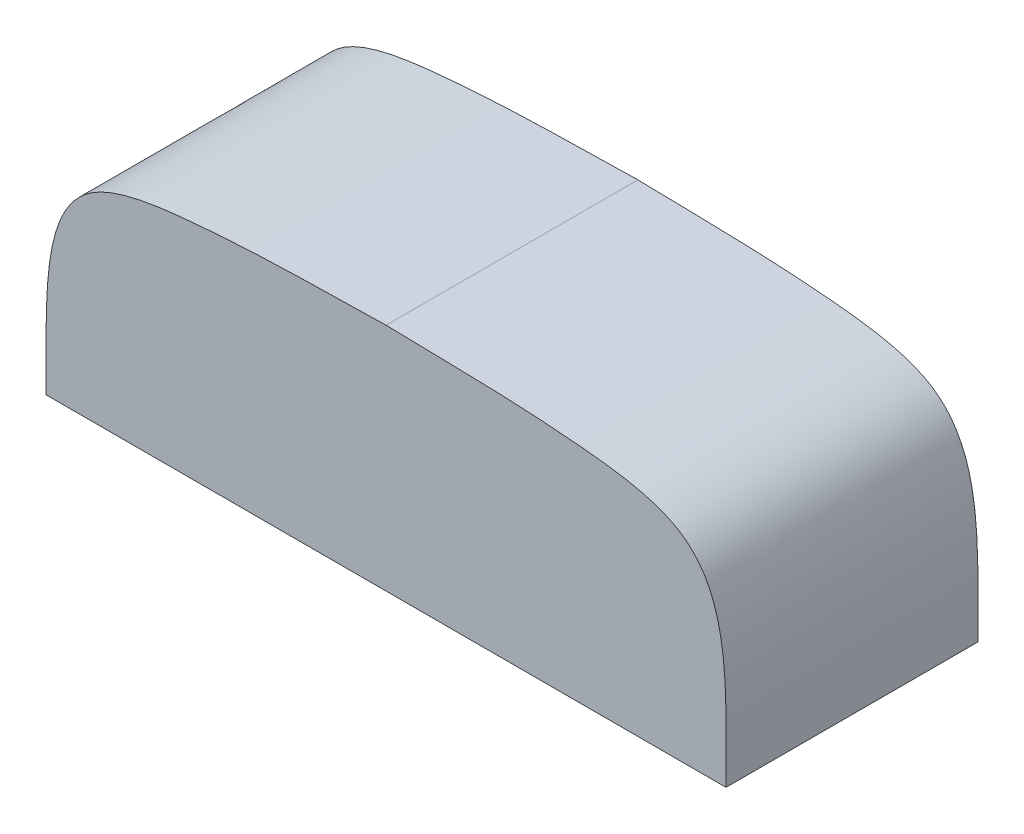
ISO-10303-21;
HEADER;
FILE_DESCRIPTION(('STEP AP214'),'2;1');
FILE_NAME('part.step','',(''),(''),'','','');
FILE_SCHEMA(('AUTOMOTIVE_DESIGN { 1 0 10303 214 1 1 1 1 }'));
ENDSEC;
DATA;
#1=APPLICATION_CONTEXT('core data for automotive mechanical design processes');
#2=APPLICATION_PROTOCOL_DEFINITION('international standard','automotive_design',2000,#1);
#3=PRODUCT_CONTEXT('',#1,'mechanical');
#4=PRODUCT('Part','Part','',(#3));
#5=PRODUCT_RELATED_PRODUCT_CATEGORY('part','',(#4));
#6=PRODUCT_DEFINITION_FORMATION('','',#4);
#7=PRODUCT_DEFINITION_CONTEXT('part definition',#1,'design');
#8=PRODUCT_DEFINITION('design','',#6,#7);
#9=PRODUCT_DEFINITION_SHAPE('','',#8);
#10=(LENGTH_UNIT() NAMED_UNIT(*) SI_UNIT(.MILLI.,.METRE.));
#11=(NAMED_UNIT(*) PLANE_ANGLE_UNIT() SI_UNIT($,.RADIAN.));
#12=(NAMED_UNIT(*) SI_UNIT($,.STERADIAN.) SOLID_ANGLE_UNIT());
#13=UNCERTAINTY_MEASURE_WITH_UNIT(LENGTH_MEASURE(1.E-05),#10,'distance_accuracy_value','');
#14=(GEOMETRIC_REPRESENTATION_CONTEXT(3) GLOBAL_UNCERTAINTY_ASSIGNED_CONTEXT((#13)) GLOBAL_UNIT_ASSIGNED_CONTEXT((#10,
#11,#12)) REPRESENTATION_CONTEXT('',''));
#15=CARTESIAN_POINT('',(0.,0.,0.));
#16=DIRECTION('',(0.,0.,1.));
#17=DIRECTION('',(1.,0.,0.));
#18=AXIS2_PLACEMENT_3D('',#15,#16,#17);
#19=CARTESIAN_POINT('',(0.,232.258315542862,-127.));
#20=CARTESIAN_POINT('',(-64.9765780034488,230.634372269803,-127.));
#21=CARTESIAN_POINT('',(-157.616080249969,231.087982089465,-127.));
#22=CARTESIAN_POINT('',(-351.002633093684,205.17983669473,-127.));
#23=CARTESIAN_POINT('',(-342.883010646156,85.4029147724301,-127.));
#24=CARTESIAN_POINT('',(-342.9,-3.8839016988672E-13,-127.));
#25=B_SPLINE_CURVE_WITH_KNOTS('',3,(#19,#20,#21,#22,#23,#24),.UNSPECIFIED.,.F.,.F.,(4,1,1,4),
(0.,0.225226498309052,0.337839747463577,0.5719992001852),.UNSPECIFIED.);
#26=DIRECTION('',(0.,0.,1.));
#27=VECTOR('',#26,1.);
#28=SURFACE_OF_LINEAR_EXTRUSION('',#25,#27);
#29=DIRECTION('',(0.,0.,1.));
#30=VECTOR('',#29,1.);
#31=CARTESIAN_POINT('',(-342.9,-1.39497428716783E-13,-127.));
#32=LINE('',#31,#30);
#33=CARTESIAN_POINT('',(-342.9,-1.39497428716783E-13,-127.));
#34=VERTEX_POINT('',#33);
#35=CARTESIAN_POINT('',(-342.9,-1.39497428716783E-13,127.));
#36=VERTEX_POINT('',#35);
#37=EDGE_CURVE('E43',#34,#36,#32,.T.);
#38=ORIENTED_EDGE('',*,*,#37,.T.);
#39=CARTESIAN_POINT('',(0.,232.258315542862,127.));
#40=CARTESIAN_POINT('',(-64.9765780034488,230.634372269803,127.));
#41=CARTESIAN_POINT('',(-157.616080249969,231.087982089465,127.));
#42=CARTESIAN_POINT('',(-351.002633093684,205.17983669473,127.));
#43=CARTESIAN_POINT('',(-342.883010646156,85.4029147724301,127.));
#44=CARTESIAN_POINT('',(-342.9,-3.8839016988672E-13,127.));
#45=B_SPLINE_CURVE_WITH_KNOTS('',3,(#39,#40,#41,#42,#43,#44),.UNSPECIFIED.,.F.,.F.,(4,1,1,4),
(0.,0.225226498309052,0.337839747463577,0.5719992001852),.UNSPECIFIED.);
#46=CARTESIAN_POINT('',(0.,232.258315542862,127.));
#47=VERTEX_POINT('',#46);
#48=EDGE_CURVE('E74',#47,#36,#45,.T.);
#49=ORIENTED_EDGE('',*,*,#48,.F.);
#50=DIRECTION('',(0.,0.,1.));
#51=VECTOR('',#50,1.);
#52=CARTESIAN_POINT('',(0.,232.258315542862,-127.));
#53=LINE('',#52,#51);
#54=CARTESIAN_POINT('',(0.,232.258315542862,-127.));
#55=VERTEX_POINT('',#54);
#56=EDGE_CURVE('E11',#55,#47,#53,.T.);
#57=ORIENTED_EDGE('',*,*,#56,.F.);
#58=EDGE_CURVE('E75',#55,#34,#25,.T.);
#59=ORIENTED_EDGE('',*,*,#58,.T.);
#60=EDGE_LOOP('',(#38,#49,#57,#59));
#61=FACE_BOUND('',#60,.T.);
#62=ADVANCED_FACE('F39',(#61),#28,.T.);
#63=CARTESIAN_POINT('',(342.9,-3.04403892401195E-13,-127.));
#64=CARTESIAN_POINT('',(342.883010646156,85.4029147724302,-127.));
#65=CARTESIAN_POINT('',(351.002633093684,205.179836694731,-127.));
#66=CARTESIAN_POINT('',(157.616080249969,231.087982089465,-127.));
#67=CARTESIAN_POINT('',(64.9765780034488,230.634372269803,-127.));
#68=CARTESIAN_POINT('',(0.,232.258315542862,-127.));
#69=B_SPLINE_CURVE_WITH_KNOTS('',3,(#63,#64,#65,#66,#67,#68),.UNSPECIFIED.,.F.,.F.,(4,1,1,4),
(0.,0.234159452721623,0.346772701876149,0.5719992001852),.UNSPECIFIED.);
#70=DIRECTION('',(0.,0.,1.));
#71=VECTOR('',#70,1.);
#72=SURFACE_OF_LINEAR_EXTRUSION('',#69,#71);
#73=ORIENTED_EDGE('',*,*,#56,.T.);
#74=CARTESIAN_POINT('',(342.9,-3.04403892401195E-13,127.));
#75=CARTESIAN_POINT('',(342.883010646156,85.4029147724302,127.));
#76=CARTESIAN_POINT('',(351.002633093684,205.179836694731,127.));
#77=CARTESIAN_POINT('',(157.616080249969,231.087982089465,127.));
#78=CARTESIAN_POINT('',(64.9765780034488,230.634372269803,127.));
#79=CARTESIAN_POINT('',(0.,232.258315542862,127.));
#80=B_SPLINE_CURVE_WITH_KNOTS('',3,(#74,#75,#76,#77,#78,#79),.UNSPECIFIED.,.F.,.F.,(4,1,1,4),
(0.,0.234159452721623,0.346772701876149,0.5719992001852),.UNSPECIFIED.);
#81=CARTESIAN_POINT('',(342.9,-3.04403892401195E-13,127.));
#82=VERTEX_POINT('',#81);
#83=EDGE_CURVE('E84',#82,#47,#80,.T.);
#84=ORIENTED_EDGE('',*,*,#83,.F.);
#85=DIRECTION('',(0.,0.,1.));
#86=VECTOR('',#85,1.);
#87=CARTESIAN_POINT('',(342.9,-3.04403892401195E-13,-127.));
#88=LINE('',#87,#86);
#89=CARTESIAN_POINT('',(342.9,-3.04403892401195E-13,-127.));
#90=VERTEX_POINT('',#89);
#91=EDGE_CURVE('E48',#90,#82,#88,.T.);
#92=ORIENTED_EDGE('',*,*,#91,.F.);
#93=EDGE_CURVE('E78',#90,#55,#69,.T.);
#94=ORIENTED_EDGE('',*,*,#93,.T.);
#95=EDGE_LOOP('',(#73,#84,#92,#94));
#96=FACE_BOUND('',#95,.T.);
#97=ADVANCED_FACE('F115',(#96),#72,.T.);
#98=CARTESIAN_POINT('',(-342.9,-1.39497428716783E-13,-127.));
#99=DIRECTION('',(0.,-1.,0.));
#100=DIRECTION('',(1.,0.,0.));
#101=AXIS2_PLACEMENT_3D('',#98,#99,#100);
#102=PLANE('',#101);
#103=ORIENTED_EDGE('',*,*,#91,.T.);
#104=DIRECTION('',(1.,0.,0.));
#105=VECTOR('',#104,1.);
#106=CARTESIAN_POINT('',(-342.9,-1.39497428716783E-13,127.));
#107=LINE('',#106,#105);
#108=EDGE_CURVE('E80',#36,#82,#107,.T.);
#109=ORIENTED_EDGE('',*,*,#108,.F.);
#110=ORIENTED_EDGE('',*,*,#37,.F.);
#111=DIRECTION('',(1.,0.,0.));
#112=VECTOR('',#111,1.);
#113=CARTESIAN_POINT('',(-342.9,-1.39497428716783E-13,-127.));
#114=LINE('',#113,#112);
#115=EDGE_CURVE('E103',#34,#90,#114,.T.);
#116=ORIENTED_EDGE('',*,*,#115,.T.);
#117=EDGE_LOOP('',(#103,#109,#110,#116));
#118=FACE_BOUND('',#117,.T.);
#119=ADVANCED_FACE('F81',(#118),#102,.T.);
#120=CARTESIAN_POINT('',(-255.485555495341,215.833555277671,-127.));
#121=DIRECTION('',(0.,0.,1.));
#122=DIRECTION('',(1.,0.,0.));
#123=AXIS2_PLACEMENT_3D('',#120,#121,#122);
#124=PLANE('',#123);
#125=ORIENTED_EDGE('',*,*,#58,.F.);
#126=ORIENTED_EDGE('',*,*,#93,.F.);
#127=ORIENTED_EDGE('',*,*,#115,.F.);
#128=EDGE_LOOP('',(#125,#126,#127));
#129=FACE_BOUND('',#128,.T.);
#130=ADVANCED_FACE('F118',(#129),#124,.F.);
#131=CARTESIAN_POINT('',(-255.485555495341,215.833555277671,127.));
#132=DIRECTION('',(0.,0.,1.));
#133=DIRECTION('',(1.,0.,0.));
#134=AXIS2_PLACEMENT_3D('',#131,#132,#133);
#135=PLANE('',#134);
#136=ORIENTED_EDGE('',*,*,#48,.T.);
#137=ORIENTED_EDGE('',*,*,#108,.T.);
#138=ORIENTED_EDGE('',*,*,#83,.T.);
#139=EDGE_LOOP('',(#136,#137,#138));
#140=FACE_BOUND('',#139,.T.);
#141=ADVANCED_FACE('F86',(#140),#135,.T.);
#142=CLOSED_SHELL('',(#62,#97,#119,#130,#141));
#143=MANIFOLD_SOLID_BREP('B2',#142);
#144=ADVANCED_BREP_SHAPE_REPRESENTATION('',(#18,#143),#14);
#145=SHAPE_DEFINITION_REPRESENTATION(#9,#144);
ENDSEC;
END-ISO-10303-21;
